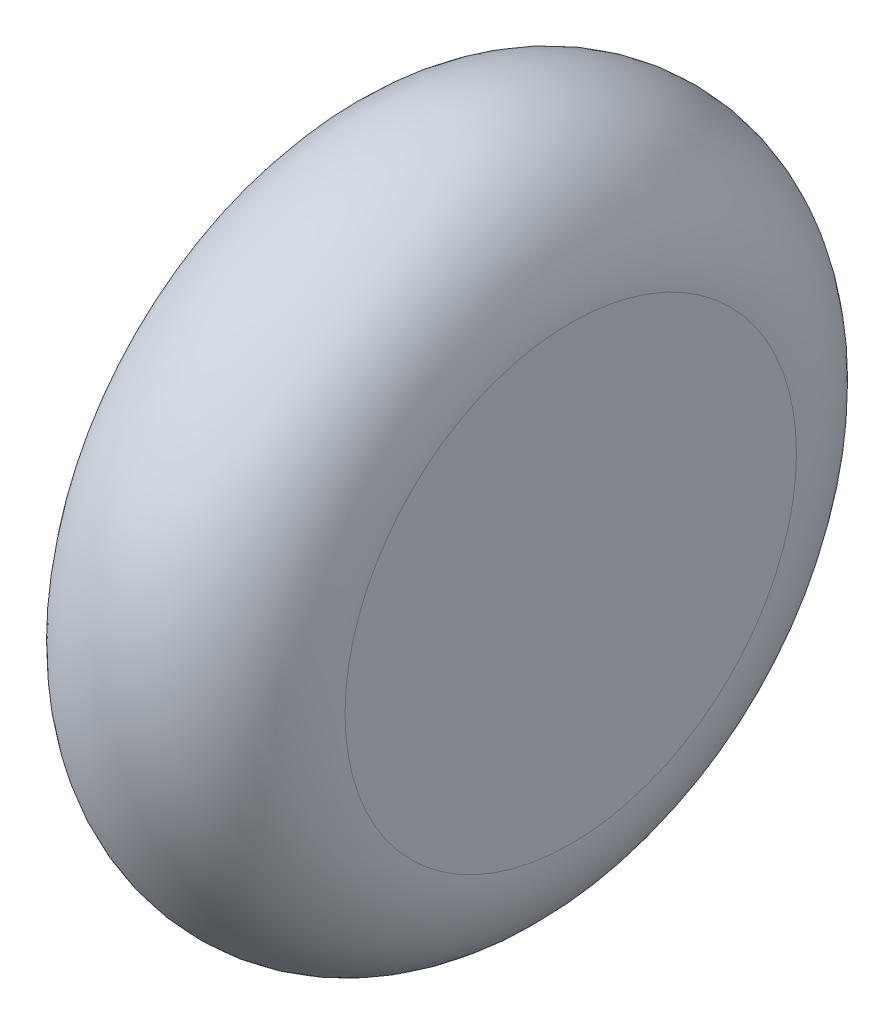
ISO-10303-21;
HEADER;
FILE_DESCRIPTION(('STEP AP214'),'2;1');
FILE_NAME('part.step','',(''),(''),'','','');
FILE_SCHEMA(('AUTOMOTIVE_DESIGN { 1 0 10303 214 1 1 1 1 }'));
ENDSEC;
DATA;
#1=APPLICATION_CONTEXT('core data for automotive mechanical design processes');
#2=APPLICATION_PROTOCOL_DEFINITION('international standard','automotive_design',2000,#1);
#3=PRODUCT_CONTEXT('',#1,'mechanical');
#4=PRODUCT('Part','Part','',(#3));
#5=PRODUCT_RELATED_PRODUCT_CATEGORY('part','',(#4));
#6=PRODUCT_DEFINITION_FORMATION('','',#4);
#7=PRODUCT_DEFINITION_CONTEXT('part definition',#1,'design');
#8=PRODUCT_DEFINITION('design','',#6,#7);
#9=PRODUCT_DEFINITION_SHAPE('','',#8);
#10=(LENGTH_UNIT() NAMED_UNIT(*) SI_UNIT(.MILLI.,.METRE.));
#11=(NAMED_UNIT(*) PLANE_ANGLE_UNIT() SI_UNIT($,.RADIAN.));
#12=(NAMED_UNIT(*) SI_UNIT($,.STERADIAN.) SOLID_ANGLE_UNIT());
#13=UNCERTAINTY_MEASURE_WITH_UNIT(LENGTH_MEASURE(1.E-05),#10,'distance_accuracy_value','');
#14=(GEOMETRIC_REPRESENTATION_CONTEXT(3) GLOBAL_UNCERTAINTY_ASSIGNED_CONTEXT((#13)) GLOBAL_UNIT_ASSIGNED_CONTEXT((#10,
#11,#12)) REPRESENTATION_CONTEXT('',''));
#15=CARTESIAN_POINT('',(0.,0.,0.));
#16=DIRECTION('',(0.,0.,1.));
#17=DIRECTION('',(1.,0.,0.));
#18=AXIS2_PLACEMENT_3D('',#15,#16,#17);
#19=CARTESIAN_POINT('',(-25.4,0.,0.));
#20=DIRECTION('',(1.,0.,0.));
#21=DIRECTION('',(0.,0.,-1.));
#22=AXIS2_PLACEMENT_3D('',#19,#20,#21);
#23=PLANE('',#22);
#24=CARTESIAN_POINT('',(-25.4,0.,0.));
#25=DIRECTION('',(-1.,0.,0.));
#26=DIRECTION('',(0.,0.,1.));
#27=AXIS2_PLACEMENT_3D('',#24,#25,#26);
#28=CIRCLE('',#27,46.355);
#29=CARTESIAN_POINT('',(-25.4,0.,46.355));
#30=VERTEX_POINT('',#29);
#31=EDGE_CURVE('E10',#30,#30,#28,.T.);
#32=ORIENTED_EDGE('',*,*,#31,.T.);
#33=EDGE_LOOP('',(#32));
#34=FACE_BOUND('',#33,.T.);
#35=ADVANCED_FACE('F31',(#34),#23,.F.);
#36=CARTESIAN_POINT('',(0.,0.,0.));
#37=DIRECTION('',(-1.,0.,0.));
#38=DIRECTION('',(0.,0.,1.));
#39=AXIS2_PLACEMENT_3D('',#36,#37,#38);
#40=TOROIDAL_SURFACE('',#39,46.355,25.4);
#41=ORIENTED_EDGE('',*,*,#31,.F.);
#42=EDGE_LOOP('',(#41));
#43=FACE_BOUND('',#42,.T.);
#44=CARTESIAN_POINT('',(25.4,0.,0.));
#45=DIRECTION('',(-1.,0.,0.));
#46=DIRECTION('',(0.,0.,1.));
#47=AXIS2_PLACEMENT_3D('',#44,#45,#46);
#48=CIRCLE('',#47,46.355);
#49=CARTESIAN_POINT('',(25.4,0.,46.355));
#50=VERTEX_POINT('',#49);
#51=EDGE_CURVE('E37',#50,#50,#48,.T.);
#52=ORIENTED_EDGE('',*,*,#51,.T.);
#53=EDGE_LOOP('',(#52));
#54=FACE_BOUND('',#53,.T.);
#55=ADVANCED_FACE('F43',(#43,#54),#40,.T.);
#56=CARTESIAN_POINT('',(25.4,0.,0.));
#57=DIRECTION('',(-1.,0.,0.));
#58=DIRECTION('',(0.,0.,1.));
#59=AXIS2_PLACEMENT_3D('',#56,#57,#58);
#60=PLANE('',#59);
#61=ORIENTED_EDGE('',*,*,#51,.F.);
#62=EDGE_LOOP('',(#61));
#63=FACE_BOUND('',#62,.T.);
#64=ADVANCED_FACE('F45',(#63),#60,.F.);
#65=CLOSED_SHELL('',(#35,#55,#64));
#66=MANIFOLD_SOLID_BREP('B2',#65);
#67=ADVANCED_BREP_SHAPE_REPRESENTATION('',(#18,#66),#14);
#68=SHAPE_DEFINITION_REPRESENTATION(#9,#67);
ENDSEC;
END-ISO-10303-21;
